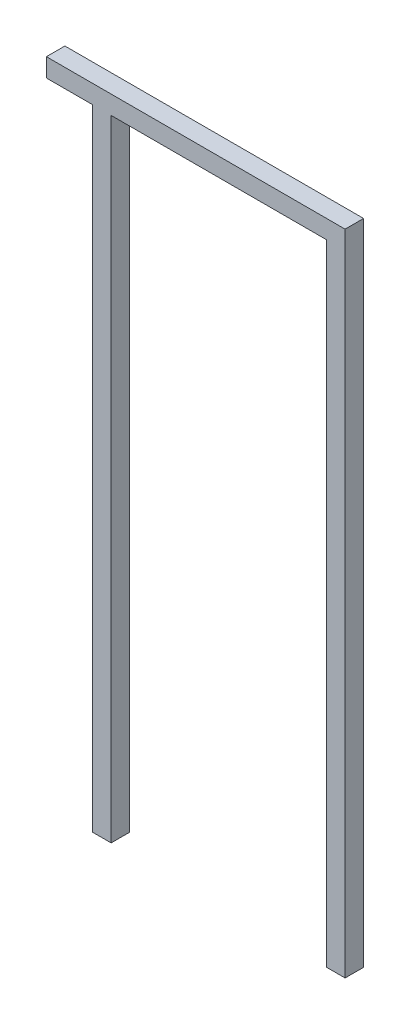
ISO-10303-21;
HEADER;
FILE_DESCRIPTION(('STEP AP214'),'2;1');
FILE_NAME('part.step','',(''),(''),'','','');
FILE_SCHEMA(('AUTOMOTIVE_DESIGN { 1 0 10303 214 1 1 1 1 }'));
ENDSEC;
DATA;
#1=APPLICATION_CONTEXT('core data for automotive mechanical design processes');
#2=APPLICATION_PROTOCOL_DEFINITION('international standard','automotive_design',2000,#1);
#3=PRODUCT_CONTEXT('',#1,'mechanical');
#4=PRODUCT('Part','Part','',(#3));
#5=PRODUCT_RELATED_PRODUCT_CATEGORY('part','',(#4));
#6=PRODUCT_DEFINITION_FORMATION('','',#4);
#7=PRODUCT_DEFINITION_CONTEXT('part definition',#1,'design');
#8=PRODUCT_DEFINITION('design','',#6,#7);
#9=PRODUCT_DEFINITION_SHAPE('','',#8);
#10=(LENGTH_UNIT() NAMED_UNIT(*) SI_UNIT(.MILLI.,.METRE.));
#11=(NAMED_UNIT(*) PLANE_ANGLE_UNIT() SI_UNIT($,.RADIAN.));
#12=(NAMED_UNIT(*) SI_UNIT($,.STERADIAN.) SOLID_ANGLE_UNIT());
#13=UNCERTAINTY_MEASURE_WITH_UNIT(LENGTH_MEASURE(1.E-05),#10,'distance_accuracy_value','');
#14=(GEOMETRIC_REPRESENTATION_CONTEXT(3) GLOBAL_UNCERTAINTY_ASSIGNED_CONTEXT((#13)) GLOBAL_UNIT_ASSIGNED_CONTEXT((#10,
#11,#12)) REPRESENTATION_CONTEXT('',''));
#15=CARTESIAN_POINT('',(0.,0.,0.));
#16=DIRECTION('',(0.,0.,1.));
#17=DIRECTION('',(1.,0.,0.));
#18=AXIS2_PLACEMENT_3D('',#15,#16,#17);
#19=CARTESIAN_POINT('',(-279.662582644628,140.993915289256,20.));
#20=DIRECTION('',(1.,0.,0.));
#21=DIRECTION('',(0.,0.,-1.));
#22=AXIS2_PLACEMENT_3D('',#19,#20,#21);
#23=PLANE('',#22);
#24=DIRECTION('',(0.,-1.,0.));
#25=VECTOR('',#24,1.);
#26=CARTESIAN_POINT('',(-279.662582644628,140.993915289256,0.));
#27=LINE('',#26,#25);
#28=CARTESIAN_POINT('',(-279.662582644628,140.993915289256,0.));
#29=VERTEX_POINT('',#28);
#30=CARTESIAN_POINT('',(-279.662582644628,120.993915289256,0.));
#31=VERTEX_POINT('',#30);
#32=EDGE_CURVE('E141',#29,#31,#27,.T.);
#33=ORIENTED_EDGE('',*,*,#32,.T.);
#34=DIRECTION('',(0.,0.,-1.));
#35=VECTOR('',#34,1.);
#36=CARTESIAN_POINT('',(-279.662582644628,120.993915289256,20.));
#37=LINE('',#36,#35);
#38=CARTESIAN_POINT('',(-279.662582644628,120.993915289256,20.));
#39=VERTEX_POINT('',#38);
#40=EDGE_CURVE('E11',#39,#31,#37,.T.);
#41=ORIENTED_EDGE('',*,*,#40,.F.);
#42=DIRECTION('',(0.,-1.,0.));
#43=VECTOR('',#42,1.);
#44=CARTESIAN_POINT('',(-279.662582644628,140.993915289256,20.));
#45=LINE('',#44,#43);
#46=CARTESIAN_POINT('',(-279.662582644628,140.993915289256,20.));
#47=VERTEX_POINT('',#46);
#48=EDGE_CURVE('E159',#47,#39,#45,.T.);
#49=ORIENTED_EDGE('',*,*,#48,.F.);
#50=DIRECTION('',(0.,0.,-1.));
#51=VECTOR('',#50,1.);
#52=CARTESIAN_POINT('',(-279.662582644628,140.993915289256,20.));
#53=LINE('',#52,#51);
#54=EDGE_CURVE('E137',#47,#29,#53,.T.);
#55=ORIENTED_EDGE('',*,*,#54,.T.);
#56=EDGE_LOOP('',(#33,#41,#49,#55));
#57=FACE_BOUND('',#56,.T.);
#58=ADVANCED_FACE('F33',(#57),#23,.F.);
#59=CARTESIAN_POINT('',(-229.662582644628,120.993915289256,20.));
#60=DIRECTION('',(0.,1.,0.));
#61=DIRECTION('',(0.,0.,1.));
#62=AXIS2_PLACEMENT_3D('',#59,#60,#61);
#63=PLANE('',#62);
#64=DIRECTION('',(1.,0.,0.));
#65=VECTOR('',#64,1.);
#66=CARTESIAN_POINT('',(-229.662582644628,120.993915289256,0.));
#67=LINE('',#66,#65);
#68=CARTESIAN_POINT('',(-229.662582644628,120.993915289256,0.));
#69=VERTEX_POINT('',#68);
#70=EDGE_CURVE('E144',#31,#69,#67,.T.);
#71=ORIENTED_EDGE('',*,*,#70,.T.);
#72=DIRECTION('',(0.,0.,-1.));
#73=VECTOR('',#72,1.);
#74=CARTESIAN_POINT('',(-229.662582644628,120.993915289256,20.));
#75=LINE('',#74,#73);
#76=CARTESIAN_POINT('',(-229.662582644628,120.993915289256,20.));
#77=VERTEX_POINT('',#76);
#78=EDGE_CURVE('E41',#77,#69,#75,.T.);
#79=ORIENTED_EDGE('',*,*,#78,.F.);
#80=DIRECTION('',(1.,0.,0.));
#81=VECTOR('',#80,1.);
#82=CARTESIAN_POINT('',(-229.662582644628,120.993915289256,20.));
#83=LINE('',#82,#81);
#84=EDGE_CURVE('E98',#39,#77,#83,.T.);
#85=ORIENTED_EDGE('',*,*,#84,.F.);
#86=ORIENTED_EDGE('',*,*,#40,.T.);
#87=EDGE_LOOP('',(#71,#79,#85,#86));
#88=FACE_BOUND('',#87,.T.);
#89=ADVANCED_FACE('F208',(#88),#63,.F.);
#90=CARTESIAN_POINT('',(-229.662582644628,-560.336084710744,20.));
#91=DIRECTION('',(1.,0.,0.));
#92=DIRECTION('',(0.,0.,-1.));
#93=AXIS2_PLACEMENT_3D('',#90,#91,#92);
#94=PLANE('',#93);
#95=DIRECTION('',(0.,-1.,0.));
#96=VECTOR('',#95,1.);
#97=CARTESIAN_POINT('',(-229.662582644628,-560.336084710744,0.));
#98=LINE('',#97,#96);
#99=CARTESIAN_POINT('',(-229.662582644628,-560.336084710744,0.));
#100=VERTEX_POINT('',#99);
#101=EDGE_CURVE('E146',#69,#100,#98,.T.);
#102=ORIENTED_EDGE('',*,*,#101,.T.);
#103=DIRECTION('',(0.,0.,-1.));
#104=VECTOR('',#103,1.);
#105=CARTESIAN_POINT('',(-229.662582644628,-560.336084710744,20.));
#106=LINE('',#105,#104);
#107=CARTESIAN_POINT('',(-229.662582644628,-560.336084710744,20.));
#108=VERTEX_POINT('',#107);
#109=EDGE_CURVE('E172',#108,#100,#106,.T.);
#110=ORIENTED_EDGE('',*,*,#109,.F.);
#111=DIRECTION('',(0.,-1.,0.));
#112=VECTOR('',#111,1.);
#113=CARTESIAN_POINT('',(-229.662582644628,-560.336084710744,20.));
#114=LINE('',#113,#112);
#115=EDGE_CURVE('E180',#77,#108,#114,.T.);
#116=ORIENTED_EDGE('',*,*,#115,.F.);
#117=ORIENTED_EDGE('',*,*,#78,.T.);
#118=EDGE_LOOP('',(#102,#110,#116,#117));
#119=FACE_BOUND('',#118,.T.);
#120=ADVANCED_FACE('F178',(#119),#94,.F.);
#121=CARTESIAN_POINT('',(-209.662582644628,-560.336084710744,20.));
#122=DIRECTION('',(0.,1.,0.));
#123=DIRECTION('',(0.,0.,1.));
#124=AXIS2_PLACEMENT_3D('',#121,#122,#123);
#125=PLANE('',#124);
#126=DIRECTION('',(1.,0.,0.));
#127=VECTOR('',#126,1.);
#128=CARTESIAN_POINT('',(-209.662582644628,-560.336084710744,0.));
#129=LINE('',#128,#127);
#130=CARTESIAN_POINT('',(-209.662582644628,-560.336084710744,0.));
#131=VERTEX_POINT('',#130);
#132=EDGE_CURVE('E148',#100,#131,#129,.T.);
#133=ORIENTED_EDGE('',*,*,#132,.T.);
#134=DIRECTION('',(0.,0.,-1.));
#135=VECTOR('',#134,1.);
#136=CARTESIAN_POINT('',(-209.662582644628,-560.336084710744,20.));
#137=LINE('',#136,#135);
#138=CARTESIAN_POINT('',(-209.662582644628,-560.336084710744,20.));
#139=VERTEX_POINT('',#138);
#140=EDGE_CURVE('E169',#139,#131,#137,.T.);
#141=ORIENTED_EDGE('',*,*,#140,.F.);
#142=DIRECTION('',(1.,0.,0.));
#143=VECTOR('',#142,1.);
#144=CARTESIAN_POINT('',(-209.662582644628,-560.336084710744,20.));
#145=LINE('',#144,#143);
#146=EDGE_CURVE('E198',#108,#139,#145,.T.);
#147=ORIENTED_EDGE('',*,*,#146,.F.);
#148=ORIENTED_EDGE('',*,*,#109,.T.);
#149=EDGE_LOOP('',(#133,#141,#147,#148));
#150=FACE_BOUND('',#149,.T.);
#151=ADVANCED_FACE('F189',(#150),#125,.F.);
#152=CARTESIAN_POINT('',(-209.662582644628,120.993915289256,20.));
#153=DIRECTION('',(-1.,0.,0.));
#154=DIRECTION('',(0.,-1.,0.));
#155=AXIS2_PLACEMENT_3D('',#152,#153,#154);
#156=PLANE('',#155);
#157=DIRECTION('',(0.,1.,0.));
#158=VECTOR('',#157,1.);
#159=CARTESIAN_POINT('',(-209.662582644628,120.993915289256,0.));
#160=LINE('',#159,#158);
#161=CARTESIAN_POINT('',(-209.662582644628,120.993915289256,0.));
#162=VERTEX_POINT('',#161);
#163=EDGE_CURVE('E150',#131,#162,#160,.T.);
#164=ORIENTED_EDGE('',*,*,#163,.T.);
#165=DIRECTION('',(0.,0.,-1.));
#166=VECTOR('',#165,1.);
#167=CARTESIAN_POINT('',(-209.662582644628,120.993915289256,20.));
#168=LINE('',#167,#166);
#169=CARTESIAN_POINT('',(-209.662582644628,120.993915289256,20.));
#170=VERTEX_POINT('',#169);
#171=EDGE_CURVE('E166',#170,#162,#168,.T.);
#172=ORIENTED_EDGE('',*,*,#171,.F.);
#173=DIRECTION('',(0.,1.,0.));
#174=VECTOR('',#173,1.);
#175=CARTESIAN_POINT('',(-209.662582644628,120.993915289256,20.));
#176=LINE('',#175,#174);
#177=EDGE_CURVE('E195',#139,#170,#176,.T.);
#178=ORIENTED_EDGE('',*,*,#177,.F.);
#179=ORIENTED_EDGE('',*,*,#140,.T.);
#180=EDGE_LOOP('',(#164,#172,#178,#179));
#181=FACE_BOUND('',#180,.T.);
#182=ADVANCED_FACE('F193',(#181),#156,.F.);
#183=CARTESIAN_POINT('',(23.3374173553718,120.993915289256,20.));
#184=DIRECTION('',(0.,1.,0.));
#185=DIRECTION('',(-1.,0.,0.));
#186=AXIS2_PLACEMENT_3D('',#183,#184,#185);
#187=PLANE('',#186);
#188=DIRECTION('',(1.,0.,0.));
#189=VECTOR('',#188,1.);
#190=CARTESIAN_POINT('',(23.3374173553718,120.993915289256,0.));
#191=LINE('',#190,#189);
#192=CARTESIAN_POINT('',(23.3374173553718,120.993915289256,0.));
#193=VERTEX_POINT('',#192);
#194=EDGE_CURVE('E152',#162,#193,#191,.T.);
#195=ORIENTED_EDGE('',*,*,#194,.T.);
#196=DIRECTION('',(0.,0.,-1.));
#197=VECTOR('',#196,1.);
#198=CARTESIAN_POINT('',(23.3374173553718,120.993915289256,20.));
#199=LINE('',#198,#197);
#200=CARTESIAN_POINT('',(23.3374173553718,120.993915289256,20.));
#201=VERTEX_POINT('',#200);
#202=EDGE_CURVE('E163',#201,#193,#199,.T.);
#203=ORIENTED_EDGE('',*,*,#202,.F.);
#204=DIRECTION('',(1.,0.,0.));
#205=VECTOR('',#204,1.);
#206=CARTESIAN_POINT('',(23.3374173553718,120.993915289256,20.));
#207=LINE('',#206,#205);
#208=EDGE_CURVE('E197',#170,#201,#207,.T.);
#209=ORIENTED_EDGE('',*,*,#208,.F.);
#210=ORIENTED_EDGE('',*,*,#171,.T.);
#211=EDGE_LOOP('',(#195,#203,#209,#210));
#212=FACE_BOUND('',#211,.T.);
#213=ADVANCED_FACE('F220',(#212),#187,.F.);
#214=CARTESIAN_POINT('',(23.3374173553718,-560.336084710744,20.));
#215=DIRECTION('',(1.,0.,0.));
#216=DIRECTION('',(0.,1.,0.));
#217=AXIS2_PLACEMENT_3D('',#214,#215,#216);
#218=PLANE('',#217);
#219=DIRECTION('',(0.,-1.,0.));
#220=VECTOR('',#219,1.);
#221=CARTESIAN_POINT('',(23.3374173553718,-560.336084710744,0.));
#222=LINE('',#221,#220);
#223=CARTESIAN_POINT('',(23.3374173553718,-560.336084710744,0.));
#224=VERTEX_POINT('',#223);
#225=EDGE_CURVE('E154',#193,#224,#222,.T.);
#226=ORIENTED_EDGE('',*,*,#225,.T.);
#227=DIRECTION('',(0.,0.,-1.));
#228=VECTOR('',#227,1.);
#229=CARTESIAN_POINT('',(23.3374173553718,-560.336084710744,20.));
#230=LINE('',#229,#228);
#231=CARTESIAN_POINT('',(23.3374173553718,-560.336084710744,20.));
#232=VERTEX_POINT('',#231);
#233=EDGE_CURVE('E132',#232,#224,#230,.T.);
#234=ORIENTED_EDGE('',*,*,#233,.F.);
#235=DIRECTION('',(0.,-1.,0.));
#236=VECTOR('',#235,1.);
#237=CARTESIAN_POINT('',(23.3374173553718,-560.336084710744,20.));
#238=LINE('',#237,#236);
#239=EDGE_CURVE('E123',#201,#232,#238,.T.);
#240=ORIENTED_EDGE('',*,*,#239,.F.);
#241=ORIENTED_EDGE('',*,*,#202,.T.);
#242=EDGE_LOOP('',(#226,#234,#240,#241));
#243=FACE_BOUND('',#242,.T.);
#244=ADVANCED_FACE('F223',(#243),#218,.F.);
#245=CARTESIAN_POINT('',(43.3374173553718,-560.336084710744,20.));
#246=DIRECTION('',(0.,1.,0.));
#247=DIRECTION('',(0.,0.,1.));
#248=AXIS2_PLACEMENT_3D('',#245,#246,#247);
#249=PLANE('',#248);
#250=DIRECTION('',(1.,0.,0.));
#251=VECTOR('',#250,1.);
#252=CARTESIAN_POINT('',(43.3374173553718,-560.336084710744,0.));
#253=LINE('',#252,#251);
#254=CARTESIAN_POINT('',(43.3374173553718,-560.336084710744,0.));
#255=VERTEX_POINT('',#254);
#256=EDGE_CURVE('E131',#224,#255,#253,.T.);
#257=ORIENTED_EDGE('',*,*,#256,.T.);
#258=DIRECTION('',(0.,0.,-1.));
#259=VECTOR('',#258,1.);
#260=CARTESIAN_POINT('',(43.3374173553718,-560.336084710744,20.));
#261=LINE('',#260,#259);
#262=CARTESIAN_POINT('',(43.3374173553718,-560.336084710744,20.));
#263=VERTEX_POINT('',#262);
#264=EDGE_CURVE('E128',#263,#255,#261,.T.);
#265=ORIENTED_EDGE('',*,*,#264,.F.);
#266=DIRECTION('',(1.,0.,0.));
#267=VECTOR('',#266,1.);
#268=CARTESIAN_POINT('',(43.3374173553718,-560.336084710744,20.));
#269=LINE('',#268,#267);
#270=EDGE_CURVE('E117',#232,#263,#269,.T.);
#271=ORIENTED_EDGE('',*,*,#270,.F.);
#272=ORIENTED_EDGE('',*,*,#233,.T.);
#273=EDGE_LOOP('',(#257,#265,#271,#272));
#274=FACE_BOUND('',#273,.T.);
#275=ADVANCED_FACE('F129',(#274),#249,.F.);
#276=CARTESIAN_POINT('',(43.3374173553717,140.993915289256,20.));
#277=DIRECTION('',(-1.,0.,0.));
#278=DIRECTION('',(0.,-1.,0.));
#279=AXIS2_PLACEMENT_3D('',#276,#277,#278);
#280=PLANE('',#279);
#281=DIRECTION('',(0.,1.,0.));
#282=VECTOR('',#281,1.);
#283=CARTESIAN_POINT('',(43.3374173553717,140.993915289256,0.));
#284=LINE('',#283,#282);
#285=CARTESIAN_POINT('',(43.3374173553717,140.993915289256,0.));
#286=VERTEX_POINT('',#285);
#287=EDGE_CURVE('E84',#255,#286,#284,.T.);
#288=ORIENTED_EDGE('',*,*,#287,.T.);
#289=DIRECTION('',(0.,0.,-1.));
#290=VECTOR('',#289,1.);
#291=CARTESIAN_POINT('',(43.3374173553717,140.993915289256,20.));
#292=LINE('',#291,#290);
#293=CARTESIAN_POINT('',(43.3374173553717,140.993915289256,20.));
#294=VERTEX_POINT('',#293);
#295=EDGE_CURVE('E133',#294,#286,#292,.T.);
#296=ORIENTED_EDGE('',*,*,#295,.F.);
#297=DIRECTION('',(0.,1.,0.));
#298=VECTOR('',#297,1.);
#299=CARTESIAN_POINT('',(43.3374173553717,140.993915289256,20.));
#300=LINE('',#299,#298);
#301=EDGE_CURVE('E121',#263,#294,#300,.T.);
#302=ORIENTED_EDGE('',*,*,#301,.F.);
#303=ORIENTED_EDGE('',*,*,#264,.T.);
#304=EDGE_LOOP('',(#288,#296,#302,#303));
#305=FACE_BOUND('',#304,.T.);
#306=ADVANCED_FACE('F135',(#305),#280,.F.);
#307=CARTESIAN_POINT('',(-279.662582644628,140.993915289256,20.));
#308=DIRECTION('',(0.,-1.,0.));
#309=DIRECTION('',(1.,0.,0.));
#310=AXIS2_PLACEMENT_3D('',#307,#308,#309);
#311=PLANE('',#310);
#312=DIRECTION('',(-1.,0.,0.));
#313=VECTOR('',#312,1.);
#314=CARTESIAN_POINT('',(-279.662582644628,140.993915289256,0.));
#315=LINE('',#314,#313);
#316=EDGE_CURVE('E90',#286,#29,#315,.T.);
#317=ORIENTED_EDGE('',*,*,#316,.T.);
#318=ORIENTED_EDGE('',*,*,#54,.F.);
#319=DIRECTION('',(-1.,0.,0.));
#320=VECTOR('',#319,1.);
#321=CARTESIAN_POINT('',(-279.662582644628,140.993915289256,20.));
#322=LINE('',#321,#320);
#323=EDGE_CURVE('E49',#294,#47,#322,.T.);
#324=ORIENTED_EDGE('',*,*,#323,.F.);
#325=ORIENTED_EDGE('',*,*,#295,.T.);
#326=EDGE_LOOP('',(#317,#318,#324,#325));
#327=FACE_BOUND('',#326,.T.);
#328=ADVANCED_FACE('F232',(#327),#311,.F.);
#329=CARTESIAN_POINT('',(0.,0.,20.));
#330=DIRECTION('',(0.,0.,-1.));
#331=DIRECTION('',(-1.,0.,0.));
#332=AXIS2_PLACEMENT_3D('',#329,#330,#331);
#333=PLANE('',#332);
#334=ORIENTED_EDGE('',*,*,#48,.T.);
#335=ORIENTED_EDGE('',*,*,#84,.T.);
#336=ORIENTED_EDGE('',*,*,#115,.T.);
#337=ORIENTED_EDGE('',*,*,#146,.T.);
#338=ORIENTED_EDGE('',*,*,#177,.T.);
#339=ORIENTED_EDGE('',*,*,#208,.T.);
#340=ORIENTED_EDGE('',*,*,#239,.T.);
#341=ORIENTED_EDGE('',*,*,#270,.T.);
#342=ORIENTED_EDGE('',*,*,#301,.T.);
#343=ORIENTED_EDGE('',*,*,#323,.T.);
#344=EDGE_LOOP('',(#334,#335,#336,#337,#338,#339,#340,#341,#342,#343));
#345=FACE_BOUND('',#344,.T.);
#346=ADVANCED_FACE('F119',(#345),#333,.F.);
#347=CARTESIAN_POINT('',(0.,0.,0.));
#348=DIRECTION('',(0.,0.,-1.));
#349=DIRECTION('',(-1.,0.,0.));
#350=AXIS2_PLACEMENT_3D('',#347,#348,#349);
#351=PLANE('',#350);
#352=ORIENTED_EDGE('',*,*,#32,.F.);
#353=ORIENTED_EDGE('',*,*,#316,.F.);
#354=ORIENTED_EDGE('',*,*,#287,.F.);
#355=ORIENTED_EDGE('',*,*,#256,.F.);
#356=ORIENTED_EDGE('',*,*,#225,.F.);
#357=ORIENTED_EDGE('',*,*,#194,.F.);
#358=ORIENTED_EDGE('',*,*,#163,.F.);
#359=ORIENTED_EDGE('',*,*,#132,.F.);
#360=ORIENTED_EDGE('',*,*,#101,.F.);
#361=ORIENTED_EDGE('',*,*,#70,.F.);
#362=EDGE_LOOP('',(#352,#353,#354,#355,#356,#357,#358,#359,#360,#361));
#363=FACE_BOUND('',#362,.T.);
#364=ADVANCED_FACE('F184',(#363),#351,.T.);
#365=CLOSED_SHELL('',(#58,#89,#120,#151,#182,#213,#244,#275,#306,#328,#346,#364));
#366=MANIFOLD_SOLID_BREP('B2',#365);
#367=ADVANCED_BREP_SHAPE_REPRESENTATION('',(#18,#366),#14);
#368=SHAPE_DEFINITION_REPRESENTATION(#9,#367);
ENDSEC;
END-ISO-10303-21;
